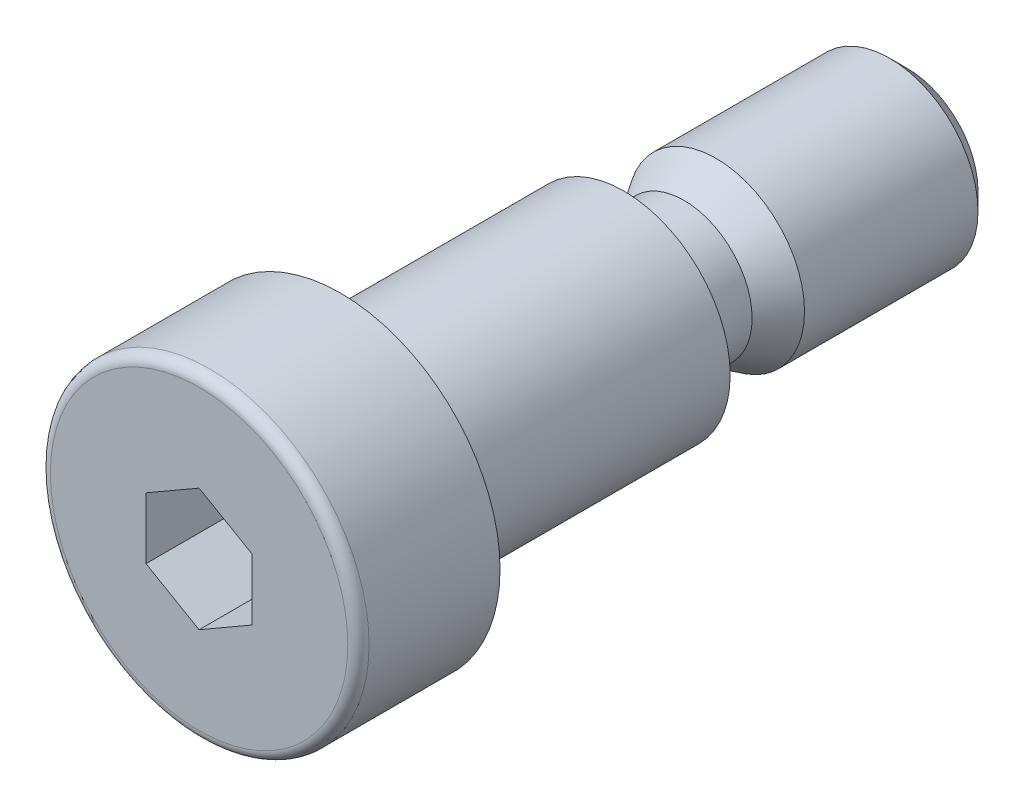
ISO-10303-21;
HEADER;
FILE_DESCRIPTION(('STEP AP214'),'2;1');
FILE_NAME('part.step','',(''),(''),'','','');
FILE_SCHEMA(('AUTOMOTIVE_DESIGN { 1 0 10303 214 1 1 1 1 }'));
ENDSEC;
DATA;
#1=APPLICATION_CONTEXT('core data for automotive mechanical design processes');
#2=APPLICATION_PROTOCOL_DEFINITION('international standard','automotive_design',2000,#1);
#3=PRODUCT_CONTEXT('',#1,'mechanical');
#4=PRODUCT('Part','Part','',(#3));
#5=PRODUCT_RELATED_PRODUCT_CATEGORY('part','',(#4));
#6=PRODUCT_DEFINITION_FORMATION('','',#4);
#7=PRODUCT_DEFINITION_CONTEXT('part definition',#1,'design');
#8=PRODUCT_DEFINITION('design','',#6,#7);
#9=PRODUCT_DEFINITION_SHAPE('','',#8);
#10=(LENGTH_UNIT() NAMED_UNIT(*) SI_UNIT(.MILLI.,.METRE.));
#11=(NAMED_UNIT(*) PLANE_ANGLE_UNIT() SI_UNIT($,.RADIAN.));
#12=(NAMED_UNIT(*) SI_UNIT($,.STERADIAN.) SOLID_ANGLE_UNIT());
#13=UNCERTAINTY_MEASURE_WITH_UNIT(LENGTH_MEASURE(1.E-05),#10,'distance_accuracy_value','');
#14=(GEOMETRIC_REPRESENTATION_CONTEXT(3) GLOBAL_UNCERTAINTY_ASSIGNED_CONTEXT((#13)) GLOBAL_UNIT_ASSIGNED_CONTEXT((#10,
#11,#12)) REPRESENTATION_CONTEXT('',''));
#15=CARTESIAN_POINT('',(0.,0.,0.));
#16=DIRECTION('',(0.,0.,1.));
#17=DIRECTION('',(1.,0.,0.));
#18=AXIS2_PLACEMENT_3D('',#15,#16,#17);
#19=CARTESIAN_POINT('',(0.,0.,16.));
#20=DIRECTION('',(0.,0.,1.));
#21=DIRECTION('',(1.,0.,0.));
#22=AXIS2_PLACEMENT_3D('',#19,#20,#21);
#23=PLANE('',#22);
#24=CARTESIAN_POINT('',(0.,0.,16.));
#25=DIRECTION('',(0.,0.,1.));
#26=DIRECTION('',(1.,0.,0.));
#27=AXIS2_PLACEMENT_3D('',#24,#25,#26);
#28=CIRCLE('',#27,8.4);
#29=CARTESIAN_POINT('',(8.4,0.,16.));
#30=VERTEX_POINT('',#29);
#31=EDGE_CURVE('E42',#30,#30,#28,.T.);
#32=ORIENTED_EDGE('',*,*,#31,.T.);
#33=EDGE_LOOP('',(#32));
#34=FACE_BOUND('',#33,.T.);
#35=DIRECTION('',(0.,1.,0.));
#36=VECTOR('',#35,1.);
#37=CARTESIAN_POINT('',(3.,-1.73205080756888,16.));
#38=LINE('',#37,#36);
#39=CARTESIAN_POINT('',(3.,-1.73205080756888,16.));
#40=VERTEX_POINT('',#39);
#41=CARTESIAN_POINT('',(3.,1.73205080756888,16.));
#42=VERTEX_POINT('',#41);
#43=EDGE_CURVE('E49',#40,#42,#38,.T.);
#44=ORIENTED_EDGE('',*,*,#43,.F.);
#45=DIRECTION('',(0.866025403784439,0.5,0.));
#46=VECTOR('',#45,1.);
#47=CARTESIAN_POINT('',(0.,-3.46410161513775,16.));
#48=LINE('',#47,#46);
#49=CARTESIAN_POINT('',(0.,-3.46410161513775,16.));
#50=VERTEX_POINT('',#49);
#51=EDGE_CURVE('E132',#50,#40,#48,.T.);
#52=ORIENTED_EDGE('',*,*,#51,.F.);
#53=DIRECTION('',(0.866025403784439,-0.5,0.));
#54=VECTOR('',#53,1.);
#55=CARTESIAN_POINT('',(-3.,-1.73205080756888,16.));
#56=LINE('',#55,#54);
#57=CARTESIAN_POINT('',(-3.,-1.73205080756888,16.));
#58=VERTEX_POINT('',#57);
#59=EDGE_CURVE('E130',#58,#50,#56,.T.);
#60=ORIENTED_EDGE('',*,*,#59,.F.);
#61=DIRECTION('',(0.,-1.,0.));
#62=VECTOR('',#61,1.);
#63=CARTESIAN_POINT('',(-3.,1.73205080756888,16.));
#64=LINE('',#63,#62);
#65=CARTESIAN_POINT('',(-3.,1.73205080756888,16.));
#66=VERTEX_POINT('',#65);
#67=EDGE_CURVE('E97',#66,#58,#64,.T.);
#68=ORIENTED_EDGE('',*,*,#67,.F.);
#69=DIRECTION('',(-0.866025403784439,-0.5,0.));
#70=VECTOR('',#69,1.);
#71=CARTESIAN_POINT('',(0.,3.46410161513775,16.));
#72=LINE('',#71,#70);
#73=CARTESIAN_POINT('',(0.,3.46410161513775,16.));
#74=VERTEX_POINT('',#73);
#75=EDGE_CURVE('E126',#74,#66,#72,.T.);
#76=ORIENTED_EDGE('',*,*,#75,.F.);
#77=DIRECTION('',(-0.866025403784439,0.5,0.));
#78=VECTOR('',#77,1.);
#79=CARTESIAN_POINT('',(3.,1.73205080756888,16.));
#80=LINE('',#79,#78);
#81=EDGE_CURVE('E123',#42,#74,#80,.T.);
#82=ORIENTED_EDGE('',*,*,#81,.F.);
#83=EDGE_LOOP('',(#44,#52,#60,#68,#76,#82));
#84=FACE_BOUND('',#83,.T.);
#85=ADVANCED_FACE('F34',(#34,#84),#23,.T.);
#86=CARTESIAN_POINT('',(0.,0.,-24.));
#87=DIRECTION('',(0.,0.,1.));
#88=DIRECTION('',(1.,0.,0.));
#89=AXIS2_PLACEMENT_3D('',#86,#87,#88);
#90=PLANE('',#89);
#91=CARTESIAN_POINT('',(0.,0.,-24.));
#92=DIRECTION('',(0.,0.,1.));
#93=DIRECTION('',(1.,0.,0.));
#94=AXIS2_PLACEMENT_3D('',#91,#92,#93);
#95=CIRCLE('',#94,4.);
#96=CARTESIAN_POINT('',(4.,0.,-24.));
#97=VERTEX_POINT('',#96);
#98=EDGE_CURVE('E162',#97,#97,#95,.T.);
#99=ORIENTED_EDGE('',*,*,#98,.F.);
#100=EDGE_LOOP('',(#99));
#101=FACE_BOUND('',#100,.T.);
#102=ADVANCED_FACE('F178',(#101),#90,.F.);
#103=CARTESIAN_POINT('',(0.,0.,-24.));
#104=DIRECTION('',(0.,0.,1.));
#105=DIRECTION('',(1.,0.,0.));
#106=AXIS2_PLACEMENT_3D('',#103,#104,#105);
#107=CONICAL_SURFACE('',#106,4.,0.785398163397447);
#108=CARTESIAN_POINT('',(0.,0.,-23.));
#109=DIRECTION('',(0.,0.,1.));
#110=DIRECTION('',(1.,0.,0.));
#111=AXIS2_PLACEMENT_3D('',#108,#109,#110);
#112=CIRCLE('',#111,5.);
#113=CARTESIAN_POINT('',(5.,0.,-23.));
#114=VERTEX_POINT('',#113);
#115=EDGE_CURVE('E159',#114,#114,#112,.T.);
#116=ORIENTED_EDGE('',*,*,#115,.F.);
#117=EDGE_LOOP('',(#116));
#118=FACE_BOUND('',#117,.T.);
#119=ORIENTED_EDGE('',*,*,#98,.T.);
#120=EDGE_LOOP('',(#119));
#121=FACE_BOUND('',#120,.T.);
#122=ADVANCED_FACE('F182',(#118,#121),#107,.T.);
#123=CARTESIAN_POINT('',(0.,0.,16.));
#124=DIRECTION('',(0.,0.,1.));
#125=DIRECTION('',(1.,0.,0.));
#126=AXIS2_PLACEMENT_3D('',#123,#124,#125);
#127=CYLINDRICAL_SURFACE('',#126,5.);
#128=CARTESIAN_POINT('',(0.,0.,-13.2));
#129=DIRECTION('',(0.,0.,1.));
#130=DIRECTION('',(1.,0.,0.));
#131=AXIS2_PLACEMENT_3D('',#128,#129,#130);
#132=CIRCLE('',#131,5.);
#133=CARTESIAN_POINT('',(5.,0.,-13.2));
#134=VERTEX_POINT('',#133);
#135=EDGE_CURVE('E156',#134,#134,#132,.T.);
#136=ORIENTED_EDGE('',*,*,#135,.F.);
#137=EDGE_LOOP('',(#136));
#138=FACE_BOUND('',#137,.T.);
#139=ORIENTED_EDGE('',*,*,#115,.T.);
#140=EDGE_LOOP('',(#139));
#141=FACE_BOUND('',#140,.T.);
#142=ADVANCED_FACE('F188',(#138,#141),#127,.T.);
#143=CARTESIAN_POINT('',(0.,0.,-13.2));
#144=DIRECTION('',(0.,0.,-1.));
#145=DIRECTION('',(-1.,0.,0.));
#146=AXIS2_PLACEMENT_3D('',#143,#144,#145);
#147=CONICAL_SURFACE('',#146,5.,0.566013910063246);
#148=CARTESIAN_POINT('',(0.,0.,-11.39));
#149=DIRECTION('',(0.,0.,1.));
#150=DIRECTION('',(1.,0.,0.));
#151=AXIS2_PLACEMENT_3D('',#148,#149,#150);
#152=CIRCLE('',#151,3.85);
#153=CARTESIAN_POINT('',(3.85,0.,-11.39));
#154=VERTEX_POINT('',#153);
#155=EDGE_CURVE('E153',#154,#154,#152,.T.);
#156=ORIENTED_EDGE('',*,*,#155,.F.);
#157=EDGE_LOOP('',(#156));
#158=FACE_BOUND('',#157,.T.);
#159=ORIENTED_EDGE('',*,*,#135,.T.);
#160=EDGE_LOOP('',(#159));
#161=FACE_BOUND('',#160,.T.);
#162=ADVANCED_FACE('F192',(#158,#161),#147,.T.);
#163=CARTESIAN_POINT('',(0.,0.,16.));
#164=DIRECTION('',(0.,0.,1.));
#165=DIRECTION('',(1.,0.,0.));
#166=AXIS2_PLACEMENT_3D('',#163,#164,#165);
#167=CYLINDRICAL_SURFACE('',#166,3.85);
#168=ORIENTED_EDGE('',*,*,#155,.T.);
#169=EDGE_LOOP('',(#168));
#170=FACE_BOUND('',#169,.T.);
#171=CARTESIAN_POINT('',(0.,0.,-8.));
#172=DIRECTION('',(0.,0.,1.));
#173=DIRECTION('',(1.,0.,0.));
#174=AXIS2_PLACEMENT_3D('',#171,#172,#173);
#175=CIRCLE('',#174,3.85);
#176=CARTESIAN_POINT('',(3.85,0.,-8.));
#177=VERTEX_POINT('',#176);
#178=EDGE_CURVE('E150',#177,#177,#175,.T.);
#179=ORIENTED_EDGE('',*,*,#178,.F.);
#180=EDGE_LOOP('',(#179));
#181=FACE_BOUND('',#180,.T.);
#182=ADVANCED_FACE('F196',(#170,#181),#167,.T.);
#183=CARTESIAN_POINT('',(0.,0.,-8.));
#184=DIRECTION('',(0.,0.,1.));
#185=DIRECTION('',(1.,0.,0.));
#186=AXIS2_PLACEMENT_3D('',#183,#184,#185);
#187=PLANE('',#186);
#188=CARTESIAN_POINT('',(0.,0.,-8.));
#189=DIRECTION('',(0.,0.,1.));
#190=DIRECTION('',(1.,0.,0.));
#191=AXIS2_PLACEMENT_3D('',#188,#189,#190);
#192=CIRCLE('',#191,6.);
#193=CARTESIAN_POINT('',(6.,0.,-8.));
#194=VERTEX_POINT('',#193);
#195=EDGE_CURVE('E147',#194,#194,#192,.T.);
#196=ORIENTED_EDGE('',*,*,#195,.F.);
#197=EDGE_LOOP('',(#196));
#198=FACE_BOUND('',#197,.T.);
#199=ORIENTED_EDGE('',*,*,#178,.T.);
#200=EDGE_LOOP('',(#199));
#201=FACE_BOUND('',#200,.T.);
#202=ADVANCED_FACE('F200',(#198,#201),#187,.F.);
#203=CARTESIAN_POINT('',(0.,0.,16.));
#204=DIRECTION('',(0.,0.,1.));
#205=DIRECTION('',(1.,0.,0.));
#206=AXIS2_PLACEMENT_3D('',#203,#204,#205);
#207=CYLINDRICAL_SURFACE('',#206,6.);
#208=ORIENTED_EDGE('',*,*,#195,.T.);
#209=EDGE_LOOP('',(#208));
#210=FACE_BOUND('',#209,.T.);
#211=CARTESIAN_POINT('',(0.,0.,8.00000000000001));
#212=DIRECTION('',(0.,0.,1.));
#213=DIRECTION('',(1.,0.,0.));
#214=AXIS2_PLACEMENT_3D('',#211,#212,#213);
#215=CIRCLE('',#214,6.);
#216=CARTESIAN_POINT('',(6.,0.,8.00000000000001));
#217=VERTEX_POINT('',#216);
#218=EDGE_CURVE('E144',#217,#217,#215,.T.);
#219=ORIENTED_EDGE('',*,*,#218,.F.);
#220=EDGE_LOOP('',(#219));
#221=FACE_BOUND('',#220,.T.);
#222=ADVANCED_FACE('F204',(#210,#221),#207,.T.);
#223=CARTESIAN_POINT('',(0.,0.,8.00000000000001));
#224=DIRECTION('',(0.,0.,1.));
#225=DIRECTION('',(1.,0.,0.));
#226=AXIS2_PLACEMENT_3D('',#223,#224,#225);
#227=PLANE('',#226);
#228=CARTESIAN_POINT('',(0.,0.,8.00000000000001));
#229=DIRECTION('',(0.,0.,1.));
#230=DIRECTION('',(1.,0.,0.));
#231=AXIS2_PLACEMENT_3D('',#228,#229,#230);
#232=CIRCLE('',#231,9.);
#233=CARTESIAN_POINT('',(9.,0.,8.00000000000001));
#234=VERTEX_POINT('',#233);
#235=EDGE_CURVE('E136',#234,#234,#232,.T.);
#236=ORIENTED_EDGE('',*,*,#235,.F.);
#237=EDGE_LOOP('',(#236));
#238=FACE_BOUND('',#237,.T.);
#239=ORIENTED_EDGE('',*,*,#218,.T.);
#240=EDGE_LOOP('',(#239));
#241=FACE_BOUND('',#240,.T.);
#242=ADVANCED_FACE('F208',(#238,#241),#227,.F.);
#243=CARTESIAN_POINT('',(0.,0.,16.));
#244=DIRECTION('',(0.,0.,1.));
#245=DIRECTION('',(1.,0.,0.));
#246=AXIS2_PLACEMENT_3D('',#243,#244,#245);
#247=CYLINDRICAL_SURFACE('',#246,9.);
#248=CARTESIAN_POINT('',(0.,0.,15.4));
#249=DIRECTION('',(0.,0.,1.));
#250=DIRECTION('',(1.,0.,0.));
#251=AXIS2_PLACEMENT_3D('',#248,#249,#250);
#252=CIRCLE('',#251,9.);
#253=CARTESIAN_POINT('',(9.,0.,15.4));
#254=VERTEX_POINT('',#253);
#255=EDGE_CURVE('E11',#254,#254,#252,.F.);
#256=ORIENTED_EDGE('',*,*,#255,.T.);
#257=EDGE_LOOP('',(#256));
#258=FACE_BOUND('',#257,.T.);
#259=ORIENTED_EDGE('',*,*,#235,.T.);
#260=EDGE_LOOP('',(#259));
#261=FACE_BOUND('',#260,.T.);
#262=ADVANCED_FACE('F212',(#258,#261),#247,.T.);
#263=CARTESIAN_POINT('',(3.,-1.73205080756888,11.1));
#264=DIRECTION('',(1.,0.,0.));
#265=DIRECTION('',(0.,1.,0.));
#266=AXIS2_PLACEMENT_3D('',#263,#264,#265);
#267=PLANE('',#266);
#268=ORIENTED_EDGE('',*,*,#43,.T.);
#269=DIRECTION('',(0.,0.,1.));
#270=VECTOR('',#269,1.);
#271=CARTESIAN_POINT('',(3.,1.73205080756888,11.1));
#272=LINE('',#271,#270);
#273=CARTESIAN_POINT('',(3.,1.73205080756888,11.1));
#274=VERTEX_POINT('',#273);
#275=EDGE_CURVE('E79',#274,#42,#272,.T.);
#276=ORIENTED_EDGE('',*,*,#275,.F.);
#277=DIRECTION('',(0.,1.,0.));
#278=VECTOR('',#277,1.);
#279=CARTESIAN_POINT('',(3.,-1.73205080756888,11.1));
#280=LINE('',#279,#278);
#281=CARTESIAN_POINT('',(3.,-1.73205080756888,11.1));
#282=VERTEX_POINT('',#281);
#283=EDGE_CURVE('E134',#282,#274,#280,.T.);
#284=ORIENTED_EDGE('',*,*,#283,.F.);
#285=DIRECTION('',(0.,0.,1.));
#286=VECTOR('',#285,1.);
#287=CARTESIAN_POINT('',(3.,-1.73205080756888,11.1));
#288=LINE('',#287,#286);
#289=EDGE_CURVE('E57',#282,#40,#288,.T.);
#290=ORIENTED_EDGE('',*,*,#289,.T.);
#291=EDGE_LOOP('',(#268,#276,#284,#290));
#292=FACE_BOUND('',#291,.T.);
#293=ADVANCED_FACE('F216',(#292),#267,.F.);
#294=CARTESIAN_POINT('',(0.,-3.46410161513775,11.1));
#295=DIRECTION('',(0.5,-0.866025403784439,0.));
#296=DIRECTION('',(0.866025403784439,0.5,0.));
#297=AXIS2_PLACEMENT_3D('',#294,#295,#296);
#298=PLANE('',#297);
#299=ORIENTED_EDGE('',*,*,#51,.T.);
#300=ORIENTED_EDGE('',*,*,#289,.F.);
#301=DIRECTION('',(0.866025403784439,0.5,0.));
#302=VECTOR('',#301,1.);
#303=CARTESIAN_POINT('',(0.,-3.46410161513775,11.1));
#304=LINE('',#303,#302);
#305=CARTESIAN_POINT('',(0.,-3.46410161513775,11.1));
#306=VERTEX_POINT('',#305);
#307=EDGE_CURVE('E109',#306,#282,#304,.T.);
#308=ORIENTED_EDGE('',*,*,#307,.F.);
#309=DIRECTION('',(0.,0.,1.));
#310=VECTOR('',#309,1.);
#311=CARTESIAN_POINT('',(0.,-3.46410161513775,11.1));
#312=LINE('',#311,#310);
#313=EDGE_CURVE('E101',#306,#50,#312,.T.);
#314=ORIENTED_EDGE('',*,*,#313,.T.);
#315=EDGE_LOOP('',(#299,#300,#308,#314));
#316=FACE_BOUND('',#315,.T.);
#317=ADVANCED_FACE('F220',(#316),#298,.F.);
#318=CARTESIAN_POINT('',(-3.,-1.73205080756888,11.1));
#319=DIRECTION('',(-0.5,-0.866025403784439,0.));
#320=DIRECTION('',(0.866025403784439,-0.5,0.));
#321=AXIS2_PLACEMENT_3D('',#318,#319,#320);
#322=PLANE('',#321);
#323=ORIENTED_EDGE('',*,*,#59,.T.);
#324=ORIENTED_EDGE('',*,*,#313,.F.);
#325=DIRECTION('',(0.866025403784439,-0.5,0.));
#326=VECTOR('',#325,1.);
#327=CARTESIAN_POINT('',(-3.,-1.73205080756888,11.1));
#328=LINE('',#327,#326);
#329=CARTESIAN_POINT('',(-3.,-1.73205080756888,11.1));
#330=VERTEX_POINT('',#329);
#331=EDGE_CURVE('E105',#330,#306,#328,.T.);
#332=ORIENTED_EDGE('',*,*,#331,.F.);
#333=DIRECTION('',(0.,0.,1.));
#334=VECTOR('',#333,1.);
#335=CARTESIAN_POINT('',(-3.,-1.73205080756888,11.1));
#336=LINE('',#335,#334);
#337=EDGE_CURVE('E90',#330,#58,#336,.T.);
#338=ORIENTED_EDGE('',*,*,#337,.T.);
#339=EDGE_LOOP('',(#323,#324,#332,#338));
#340=FACE_BOUND('',#339,.T.);
#341=ADVANCED_FACE('F106',(#340),#322,.F.);
#342=CARTESIAN_POINT('',(-3.,1.73205080756888,11.1));
#343=DIRECTION('',(-1.,0.,0.));
#344=DIRECTION('',(0.,0.,1.));
#345=AXIS2_PLACEMENT_3D('',#342,#343,#344);
#346=PLANE('',#345);
#347=ORIENTED_EDGE('',*,*,#67,.T.);
#348=ORIENTED_EDGE('',*,*,#337,.F.);
#349=DIRECTION('',(0.,-1.,0.));
#350=VECTOR('',#349,1.);
#351=CARTESIAN_POINT('',(-3.,1.73205080756888,11.1));
#352=LINE('',#351,#350);
#353=CARTESIAN_POINT('',(-3.,1.73205080756888,11.1));
#354=VERTEX_POINT('',#353);
#355=EDGE_CURVE('E94',#354,#330,#352,.T.);
#356=ORIENTED_EDGE('',*,*,#355,.F.);
#357=DIRECTION('',(0.,0.,1.));
#358=VECTOR('',#357,1.);
#359=CARTESIAN_POINT('',(-3.,1.73205080756888,11.1));
#360=LINE('',#359,#358);
#361=EDGE_CURVE('E102',#354,#66,#360,.T.);
#362=ORIENTED_EDGE('',*,*,#361,.T.);
#363=EDGE_LOOP('',(#347,#348,#356,#362));
#364=FACE_BOUND('',#363,.T.);
#365=ADVANCED_FACE('F92',(#364),#346,.F.);
#366=CARTESIAN_POINT('',(0.,3.46410161513775,11.1));
#367=DIRECTION('',(-0.5,0.866025403784439,0.));
#368=DIRECTION('',(-0.866025403784439,-0.5,0.));
#369=AXIS2_PLACEMENT_3D('',#366,#367,#368);
#370=PLANE('',#369);
#371=ORIENTED_EDGE('',*,*,#75,.T.);
#372=ORIENTED_EDGE('',*,*,#361,.F.);
#373=DIRECTION('',(-0.866025403784439,-0.5,0.));
#374=VECTOR('',#373,1.);
#375=CARTESIAN_POINT('',(0.,3.46410161513775,11.1));
#376=LINE('',#375,#374);
#377=CARTESIAN_POINT('',(0.,3.46410161513775,11.1));
#378=VERTEX_POINT('',#377);
#379=EDGE_CURVE('E115',#378,#354,#376,.T.);
#380=ORIENTED_EDGE('',*,*,#379,.F.);
#381=DIRECTION('',(0.,0.,1.));
#382=VECTOR('',#381,1.);
#383=CARTESIAN_POINT('',(0.,3.46410161513775,11.1));
#384=LINE('',#383,#382);
#385=EDGE_CURVE('E139',#378,#74,#384,.T.);
#386=ORIENTED_EDGE('',*,*,#385,.T.);
#387=EDGE_LOOP('',(#371,#372,#380,#386));
#388=FACE_BOUND('',#387,.T.);
#389=ADVANCED_FACE('F223',(#388),#370,.F.);
#390=CARTESIAN_POINT('',(3.,1.73205080756888,11.1));
#391=DIRECTION('',(0.5,0.866025403784439,0.));
#392=DIRECTION('',(-0.866025403784439,0.5,0.));
#393=AXIS2_PLACEMENT_3D('',#390,#391,#392);
#394=PLANE('',#393);
#395=ORIENTED_EDGE('',*,*,#81,.T.);
#396=ORIENTED_EDGE('',*,*,#385,.F.);
#397=DIRECTION('',(-0.866025403784439,0.5,0.));
#398=VECTOR('',#397,1.);
#399=CARTESIAN_POINT('',(3.,1.73205080756888,11.1));
#400=LINE('',#399,#398);
#401=EDGE_CURVE('E117',#274,#378,#400,.T.);
#402=ORIENTED_EDGE('',*,*,#401,.F.);
#403=ORIENTED_EDGE('',*,*,#275,.T.);
#404=EDGE_LOOP('',(#395,#396,#402,#403));
#405=FACE_BOUND('',#404,.T.);
#406=ADVANCED_FACE('F174',(#405),#394,.F.);
#407=CARTESIAN_POINT('',(0.,0.,11.1));
#408=DIRECTION('',(0.,0.,1.));
#409=DIRECTION('',(1.,0.,0.));
#410=AXIS2_PLACEMENT_3D('',#407,#408,#409);
#411=PLANE('',#410);
#412=ORIENTED_EDGE('',*,*,#283,.T.);
#413=ORIENTED_EDGE('',*,*,#401,.T.);
#414=ORIENTED_EDGE('',*,*,#379,.T.);
#415=ORIENTED_EDGE('',*,*,#355,.T.);
#416=ORIENTED_EDGE('',*,*,#331,.T.);
#417=ORIENTED_EDGE('',*,*,#307,.T.);
#418=EDGE_LOOP('',(#412,#413,#414,#415,#416,#417));
#419=FACE_BOUND('',#418,.T.);
#420=ADVANCED_FACE('F112',(#419),#411,.T.);
#421=CARTESIAN_POINT('',(0.,0.,15.4));
#422=DIRECTION('',(0.,0.,1.));
#423=DIRECTION('',(1.,0.,0.));
#424=AXIS2_PLACEMENT_3D('',#421,#422,#423);
#425=TOROIDAL_SURFACE('',#424,8.4,0.6);
#426=ORIENTED_EDGE('',*,*,#255,.F.);
#427=EDGE_LOOP('',(#426));
#428=FACE_BOUND('',#427,.T.);
#429=ORIENTED_EDGE('',*,*,#31,.F.);
#430=EDGE_LOOP('',(#429));
#431=FACE_BOUND('',#430,.T.);
#432=ADVANCED_FACE('F36',(#428,#431),#425,.T.);
#433=CLOSED_SHELL('',(#85,#102,#122,#142,#162,#182,#202,#222,#242,#262,#293,#317,#341,#365,#389,
#406,#420,#432));
#434=MANIFOLD_SOLID_BREP('B2',#433);
#435=ADVANCED_BREP_SHAPE_REPRESENTATION('',(#18,#434),#14);
#436=SHAPE_DEFINITION_REPRESENTATION(#9,#435);
ENDSEC;
END-ISO-10303-21;
